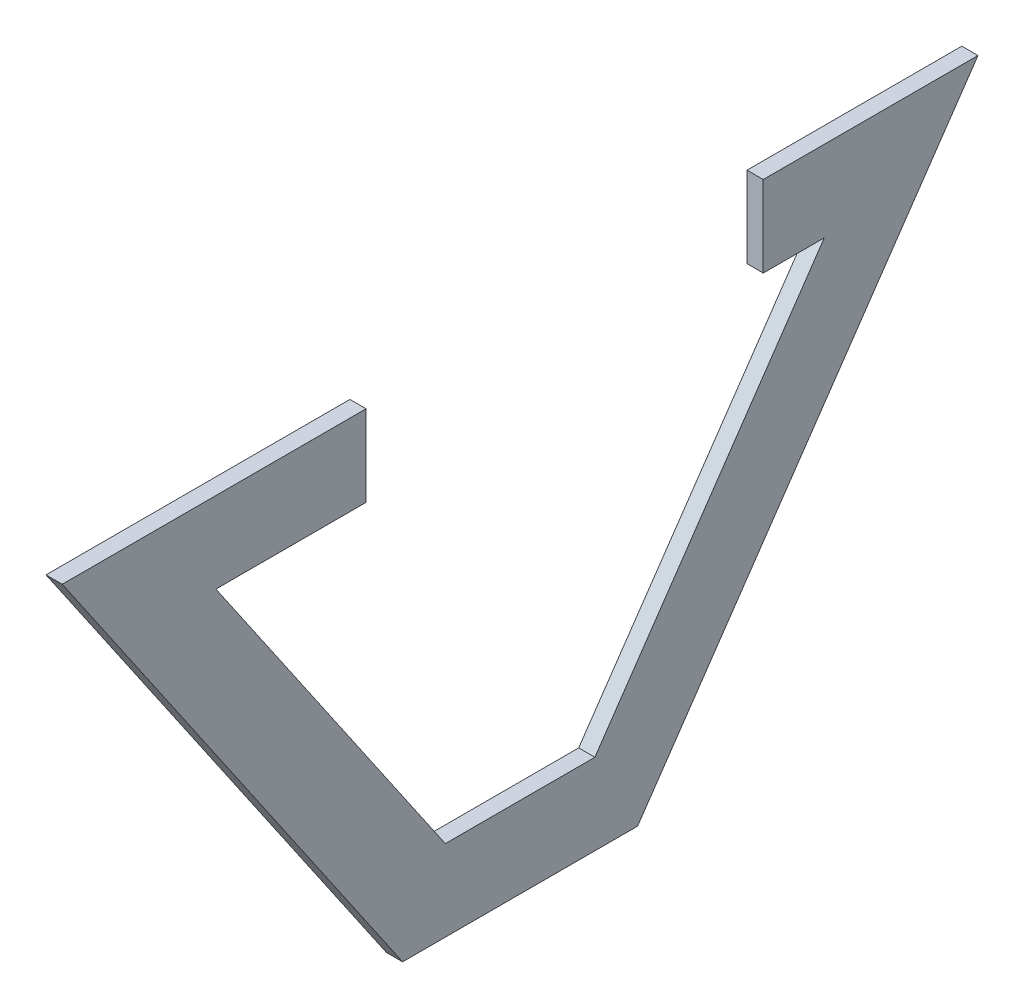
ISO-10303-21;
HEADER;
FILE_DESCRIPTION(('STEP AP214'),'2;1');
FILE_NAME('part.step','',(''),(''),'','','');
FILE_SCHEMA(('AUTOMOTIVE_DESIGN { 1 0 10303 214 1 1 1 1 }'));
ENDSEC;
DATA;
#1=APPLICATION_CONTEXT('core data for automotive mechanical design processes');
#2=APPLICATION_PROTOCOL_DEFINITION('international standard','automotive_design',2000,#1);
#3=PRODUCT_CONTEXT('',#1,'mechanical');
#4=PRODUCT('Part','Part','',(#3));
#5=PRODUCT_RELATED_PRODUCT_CATEGORY('part','',(#4));
#6=PRODUCT_DEFINITION_FORMATION('','',#4);
#7=PRODUCT_DEFINITION_CONTEXT('part definition',#1,'design');
#8=PRODUCT_DEFINITION('design','',#6,#7);
#9=PRODUCT_DEFINITION_SHAPE('','',#8);
#10=(LENGTH_UNIT() NAMED_UNIT(*) SI_UNIT(.MILLI.,.METRE.));
#11=(NAMED_UNIT(*) PLANE_ANGLE_UNIT() SI_UNIT($,.RADIAN.));
#12=(NAMED_UNIT(*) SI_UNIT($,.STERADIAN.) SOLID_ANGLE_UNIT());
#13=UNCERTAINTY_MEASURE_WITH_UNIT(LENGTH_MEASURE(1.E-05),#10,'distance_accuracy_value','');
#14=(GEOMETRIC_REPRESENTATION_CONTEXT(3) GLOBAL_UNCERTAINTY_ASSIGNED_CONTEXT((#13)) GLOBAL_UNIT_ASSIGNED_CONTEXT((#10,
#11,#12)) REPRESENTATION_CONTEXT('',''));
#15=CARTESIAN_POINT('',(0.,0.,0.));
#16=DIRECTION('',(0.,0.,1.));
#17=DIRECTION('',(1.,0.,0.));
#18=AXIS2_PLACEMENT_3D('',#15,#16,#17);
#19=CARTESIAN_POINT('',(-2.,39.3247126436782,-56.5));
#20=DIRECTION('',(0.,1.,0.));
#21=DIRECTION('',(0.,0.,1.));
#22=AXIS2_PLACEMENT_3D('',#19,#20,#21);
#23=PLANE('',#22);
#24=DIRECTION('',(-1.,0.,0.));
#25=VECTOR('',#24,1.);
#26=CARTESIAN_POINT('',(-2.,39.3247126436782,-30.));
#27=LINE('',#26,#25);
#28=CARTESIAN_POINT('',(0.,39.3247126436782,-30.));
#29=VERTEX_POINT('',#28);
#30=CARTESIAN_POINT('',(-2.,39.3247126436782,-30.));
#31=VERTEX_POINT('',#30);
#32=EDGE_CURVE('E193',#29,#31,#27,.T.);
#33=ORIENTED_EDGE('',*,*,#32,.F.);
#34=DIRECTION('',(0.,0.,1.));
#35=VECTOR('',#34,1.);
#36=CARTESIAN_POINT('',(0.,39.3247126436782,-56.5));
#37=LINE('',#36,#35);
#38=CARTESIAN_POINT('',(0.,39.3247126436782,-56.5));
#39=VERTEX_POINT('',#38);
#40=EDGE_CURVE('E154',#39,#29,#37,.T.);
#41=ORIENTED_EDGE('',*,*,#40,.F.);
#42=DIRECTION('',(1.,0.,0.));
#43=VECTOR('',#42,1.);
#44=CARTESIAN_POINT('',(-2.,39.3247126436782,-56.5));
#45=LINE('',#44,#43);
#46=CARTESIAN_POINT('',(-2.,39.3247126436782,-56.5));
#47=VERTEX_POINT('',#46);
#48=EDGE_CURVE('E174',#47,#39,#45,.T.);
#49=ORIENTED_EDGE('',*,*,#48,.F.);
#50=DIRECTION('',(0.,0.,1.));
#51=VECTOR('',#50,1.);
#52=CARTESIAN_POINT('',(-2.,39.3247126436782,-56.5));
#53=LINE('',#52,#51);
#54=EDGE_CURVE('E226',#47,#31,#53,.T.);
#55=ORIENTED_EDGE('',*,*,#54,.T.);
#56=EDGE_LOOP('',(#33,#41,#49,#55));
#57=FACE_BOUND('',#56,.T.);
#58=ADVANCED_FACE('F45',(#57),#23,.T.);
#59=CARTESIAN_POINT('',(-2.,29.3247126436782,-37.5352547996728));
#60=DIRECTION('',(0.,1.,0.));
#61=DIRECTION('',(0.,0.,1.));
#62=AXIS2_PLACEMENT_3D('',#59,#60,#61);
#63=PLANE('',#62);
#64=DIRECTION('',(0.,0.,1.));
#65=VECTOR('',#64,1.);
#66=CARTESIAN_POINT('',(0.,29.3247126436782,-37.5352547996728));
#67=LINE('',#66,#65);
#68=CARTESIAN_POINT('',(0.,29.3247126436782,-37.5352547996728));
#69=VERTEX_POINT('',#68);
#70=CARTESIAN_POINT('',(0.,29.3247126436782,-30.));
#71=VERTEX_POINT('',#70);
#72=EDGE_CURVE('E209',#69,#71,#67,.T.);
#73=ORIENTED_EDGE('',*,*,#72,.T.);
#74=DIRECTION('',(-1.,0.,0.));
#75=VECTOR('',#74,1.);
#76=CARTESIAN_POINT('',(-2.,29.3247126436782,-30.));
#77=LINE('',#76,#75);
#78=CARTESIAN_POINT('',(-2.,29.3247126436782,-30.));
#79=VERTEX_POINT('',#78);
#80=EDGE_CURVE('E11',#71,#79,#77,.T.);
#81=ORIENTED_EDGE('',*,*,#80,.T.);
#82=DIRECTION('',(0.,0.,1.));
#83=VECTOR('',#82,1.);
#84=CARTESIAN_POINT('',(-2.,29.3247126436782,-37.5352547996728));
#85=LINE('',#84,#83);
#86=CARTESIAN_POINT('',(-2.,29.3247126436782,-37.5352547996728));
#87=VERTEX_POINT('',#86);
#88=EDGE_CURVE('E200',#87,#79,#85,.T.);
#89=ORIENTED_EDGE('',*,*,#88,.F.);
#90=DIRECTION('',(1.,0.,0.));
#91=VECTOR('',#90,1.);
#92=CARTESIAN_POINT('',(-2.,29.3247126436782,-37.5352547996728));
#93=LINE('',#92,#91);
#94=EDGE_CURVE('E207',#87,#69,#93,.T.);
#95=ORIENTED_EDGE('',*,*,#94,.T.);
#96=EDGE_LOOP('',(#73,#81,#89,#95));
#97=FACE_BOUND('',#96,.T.);
#98=ADVANCED_FACE('F251',(#97),#63,.F.);
#99=CARTESIAN_POINT('',(-2.,-22.0258620689655,-14.5));
#100=DIRECTION('',(0.,-0.564897269685444,-0.825161241638221));
#101=DIRECTION('',(0.,0.825161241638221,-0.564897269685444));
#102=AXIS2_PLACEMENT_3D('',#99,#100,#101);
#103=PLANE('',#102);
#104=DIRECTION('',(0.,0.825161241638221,-0.564897269685444));
#105=VECTOR('',#104,1.);
#106=CARTESIAN_POINT('',(0.,-22.0258620689655,-14.5));
#107=LINE('',#106,#105);
#108=CARTESIAN_POINT('',(0.,-22.0258620689655,-14.5));
#109=VERTEX_POINT('',#108);
#110=EDGE_CURVE('E155',#109,#39,#107,.T.);
#111=ORIENTED_EDGE('',*,*,#110,.F.);
#112=DIRECTION('',(1.,0.,0.));
#113=VECTOR('',#112,1.);
#114=CARTESIAN_POINT('',(-2.,-22.0258620689655,-14.5));
#115=LINE('',#114,#113);
#116=CARTESIAN_POINT('',(-2.,-22.0258620689655,-14.5));
#117=VERTEX_POINT('',#116);
#118=EDGE_CURVE('E169',#117,#109,#115,.T.);
#119=ORIENTED_EDGE('',*,*,#118,.F.);
#120=DIRECTION('',(0.,0.825161241638221,-0.564897269685444));
#121=VECTOR('',#120,1.);
#122=CARTESIAN_POINT('',(-2.,-22.0258620689655,-14.5));
#123=LINE('',#122,#121);
#124=EDGE_CURVE('E168',#117,#47,#123,.T.);
#125=ORIENTED_EDGE('',*,*,#124,.T.);
#126=ORIENTED_EDGE('',*,*,#48,.T.);
#127=EDGE_LOOP('',(#111,#119,#125,#126));
#128=FACE_BOUND('',#127,.T.);
#129=ADVANCED_FACE('F47',(#128),#103,.T.);
#130=CARTESIAN_POINT('',(-2.,-22.0258620689655,14.5));
#131=DIRECTION('',(0.,-1.,0.));
#132=DIRECTION('',(0.,0.,-1.));
#133=AXIS2_PLACEMENT_3D('',#130,#131,#132);
#134=PLANE('',#133);
#135=DIRECTION('',(0.,0.,-1.));
#136=VECTOR('',#135,1.);
#137=CARTESIAN_POINT('',(0.,-22.0258620689655,14.5));
#138=LINE('',#137,#136);
#139=CARTESIAN_POINT('',(0.,-22.0258620689655,14.5));
#140=VERTEX_POINT('',#139);
#141=EDGE_CURVE('E165',#140,#109,#138,.T.);
#142=ORIENTED_EDGE('',*,*,#141,.F.);
#143=DIRECTION('',(1.,0.,0.));
#144=VECTOR('',#143,1.);
#145=CARTESIAN_POINT('',(-2.,-22.0258620689655,14.5));
#146=LINE('',#145,#144);
#147=CARTESIAN_POINT('',(-2.,-22.0258620689655,14.5));
#148=VERTEX_POINT('',#147);
#149=EDGE_CURVE('E171',#148,#140,#146,.T.);
#150=ORIENTED_EDGE('',*,*,#149,.F.);
#151=DIRECTION('',(0.,0.,-1.));
#152=VECTOR('',#151,1.);
#153=CARTESIAN_POINT('',(-2.,-22.0258620689655,14.5));
#154=LINE('',#153,#152);
#155=EDGE_CURVE('E175',#148,#117,#154,.T.);
#156=ORIENTED_EDGE('',*,*,#155,.T.);
#157=ORIENTED_EDGE('',*,*,#118,.T.);
#158=EDGE_LOOP('',(#142,#150,#156,#157));
#159=FACE_BOUND('',#158,.T.);
#160=ADVANCED_FACE('F235',(#159),#134,.T.);
#161=CARTESIAN_POINT('',(-2.,-22.0258620689655,14.5));
#162=DIRECTION('',(0.,-0.564897269685444,0.825161241638221));
#163=DIRECTION('',(0.,-0.825161241638221,-0.564897269685444));
#164=AXIS2_PLACEMENT_3D('',#161,#162,#163);
#165=PLANE('',#164);
#166=DIRECTION('',(0.,-0.825161241638221,-0.564897269685444));
#167=VECTOR('',#166,1.);
#168=CARTESIAN_POINT('',(0.,-22.0258620689655,14.5));
#169=LINE('',#168,#167);
#170=CARTESIAN_POINT('',(0.,39.3247126436781,56.5));
#171=VERTEX_POINT('',#170);
#172=EDGE_CURVE('E158',#171,#140,#169,.T.);
#173=ORIENTED_EDGE('',*,*,#172,.F.);
#174=DIRECTION('',(1.,0.,0.));
#175=VECTOR('',#174,1.);
#176=CARTESIAN_POINT('',(-2.,39.3247126436781,56.5));
#177=LINE('',#176,#175);
#178=CARTESIAN_POINT('',(-2.,39.3247126436781,56.5));
#179=VERTEX_POINT('',#178);
#180=EDGE_CURVE('E152',#179,#171,#177,.T.);
#181=ORIENTED_EDGE('',*,*,#180,.F.);
#182=DIRECTION('',(0.,-0.825161241638221,-0.564897269685444));
#183=VECTOR('',#182,1.);
#184=CARTESIAN_POINT('',(-2.,-22.0258620689655,14.5));
#185=LINE('',#184,#183);
#186=EDGE_CURVE('E229',#179,#148,#185,.T.);
#187=ORIENTED_EDGE('',*,*,#186,.T.);
#188=ORIENTED_EDGE('',*,*,#149,.T.);
#189=EDGE_LOOP('',(#173,#181,#187,#188));
#190=FACE_BOUND('',#189,.T.);
#191=ADVANCED_FACE('F242',(#190),#165,.T.);
#192=DIRECTION('',(1.,0.,0.));
#193=VECTOR('',#192,1.);
#194=CARTESIAN_POINT('',(-2.,39.3247126436782,19.));
#195=LINE('',#194,#193);
#196=CARTESIAN_POINT('',(-2.,39.3247126436782,19.));
#197=VERTEX_POINT('',#196);
#198=CARTESIAN_POINT('',(0.,39.3247126436782,19.));
#199=VERTEX_POINT('',#198);
#200=EDGE_CURVE('E131',#197,#199,#195,.T.);
#201=ORIENTED_EDGE('',*,*,#200,.F.);
#202=EDGE_CURVE('E188',#197,#179,#53,.T.);
#203=ORIENTED_EDGE('',*,*,#202,.T.);
#204=ORIENTED_EDGE('',*,*,#180,.T.);
#205=EDGE_CURVE('E144',#199,#171,#37,.T.);
#206=ORIENTED_EDGE('',*,*,#205,.F.);
#207=EDGE_LOOP('',(#201,#203,#204,#206));
#208=FACE_BOUND('',#207,.T.);
#209=ADVANCED_FACE('F150',(#208),#23,.T.);
#210=CARTESIAN_POINT('',(-2.,0.,0.));
#211=DIRECTION('',(1.,0.,0.));
#212=DIRECTION('',(0.,0.,-1.));
#213=AXIS2_PLACEMENT_3D('',#210,#211,#212);
#214=PLANE('',#213);
#215=ORIENTED_EDGE('',*,*,#88,.T.);
#216=DIRECTION('',(0.,1.,0.));
#217=VECTOR('',#216,1.);
#218=CARTESIAN_POINT('',(-2.,0.,-30.));
#219=LINE('',#218,#217);
#220=EDGE_CURVE('E60',#79,#31,#219,.T.);
#221=ORIENTED_EDGE('',*,*,#220,.T.);
#222=ORIENTED_EDGE('',*,*,#54,.F.);
#223=ORIENTED_EDGE('',*,*,#124,.F.);
#224=ORIENTED_EDGE('',*,*,#155,.F.);
#225=ORIENTED_EDGE('',*,*,#186,.F.);
#226=ORIENTED_EDGE('',*,*,#202,.F.);
#227=DIRECTION('',(0.,-1.,0.));
#228=VECTOR('',#227,1.);
#229=CARTESIAN_POINT('',(-2.,0.,19.));
#230=LINE('',#229,#228);
#231=CARTESIAN_POINT('',(-2.,29.3247126436782,19.));
#232=VERTEX_POINT('',#231);
#233=EDGE_CURVE('E134',#197,#232,#230,.T.);
#234=ORIENTED_EDGE('',*,*,#233,.T.);
#235=CARTESIAN_POINT('',(-2.,29.3247126436782,37.5352547996728));
#236=VERTEX_POINT('',#235);
#237=EDGE_CURVE('E181',#232,#236,#85,.T.);
#238=ORIENTED_EDGE('',*,*,#237,.T.);
#239=DIRECTION('',(0.,-0.825161241638221,-0.564897269685445));
#240=VECTOR('',#239,1.);
#241=CARTESIAN_POINT('',(-2.,-12.0258620689655,9.22705807836136));
#242=LINE('',#241,#240);
#243=CARTESIAN_POINT('',(-2.,-12.0258620689655,9.22705807836136));
#244=VERTEX_POINT('',#243);
#245=EDGE_CURVE('E202',#236,#244,#242,.T.);
#246=ORIENTED_EDGE('',*,*,#245,.T.);
#247=DIRECTION('',(0.,0.,-1.));
#248=VECTOR('',#247,1.);
#249=CARTESIAN_POINT('',(-2.,-12.0258620689655,9.22705807836136));
#250=LINE('',#249,#248);
#251=CARTESIAN_POINT('',(-2.,-12.0258620689655,-9.22705807836137));
#252=VERTEX_POINT('',#251);
#253=EDGE_CURVE('E204',#244,#252,#250,.T.);
#254=ORIENTED_EDGE('',*,*,#253,.T.);
#255=DIRECTION('',(0.,0.825161241638221,-0.564897269685444));
#256=VECTOR('',#255,1.);
#257=CARTESIAN_POINT('',(-2.,-12.0258620689655,-9.22705807836137));
#258=LINE('',#257,#256);
#259=EDGE_CURVE('E196',#252,#87,#258,.T.);
#260=ORIENTED_EDGE('',*,*,#259,.T.);
#261=EDGE_LOOP('',(#215,#221,#222,#223,#224,#225,#226,#234,#238,#246,#254,#260));
#262=FACE_BOUND('',#261,.T.);
#263=ADVANCED_FACE('F184',(#262),#214,.F.);
#264=CARTESIAN_POINT('',(0.,0.,0.));
#265=DIRECTION('',(1.,0.,0.));
#266=DIRECTION('',(0.,0.,-1.));
#267=AXIS2_PLACEMENT_3D('',#264,#265,#266);
#268=PLANE('',#267);
#269=DIRECTION('',(0.,1.,0.));
#270=VECTOR('',#269,1.);
#271=CARTESIAN_POINT('',(0.,29.0921194378148,-30.));
#272=LINE('',#271,#270);
#273=EDGE_CURVE('E148',#71,#29,#272,.T.);
#274=ORIENTED_EDGE('',*,*,#273,.F.);
#275=ORIENTED_EDGE('',*,*,#72,.F.);
#276=DIRECTION('',(0.,0.825161241638221,-0.564897269685444));
#277=VECTOR('',#276,1.);
#278=CARTESIAN_POINT('',(0.,-12.0258620689655,-9.22705807836137));
#279=LINE('',#278,#277);
#280=CARTESIAN_POINT('',(0.,-12.0258620689655,-9.22705807836137));
#281=VERTEX_POINT('',#280);
#282=EDGE_CURVE('E195',#281,#69,#279,.T.);
#283=ORIENTED_EDGE('',*,*,#282,.F.);
#284=DIRECTION('',(0.,0.,-1.));
#285=VECTOR('',#284,1.);
#286=CARTESIAN_POINT('',(0.,-12.0258620689655,9.22705807836136));
#287=LINE('',#286,#285);
#288=CARTESIAN_POINT('',(0.,-12.0258620689655,9.22705807836136));
#289=VERTEX_POINT('',#288);
#290=EDGE_CURVE('E199',#289,#281,#287,.T.);
#291=ORIENTED_EDGE('',*,*,#290,.F.);
#292=DIRECTION('',(0.,-0.825161241638221,-0.564897269685445));
#293=VECTOR('',#292,1.);
#294=CARTESIAN_POINT('',(0.,-12.0258620689655,9.22705807836136));
#295=LINE('',#294,#293);
#296=CARTESIAN_POINT('',(0.,29.3247126436782,37.5352547996728));
#297=VERTEX_POINT('',#296);
#298=EDGE_CURVE('E212',#297,#289,#295,.T.);
#299=ORIENTED_EDGE('',*,*,#298,.F.);
#300=CARTESIAN_POINT('',(0.,29.3247126436782,19.));
#301=VERTEX_POINT('',#300);
#302=EDGE_CURVE('E147',#301,#297,#67,.T.);
#303=ORIENTED_EDGE('',*,*,#302,.F.);
#304=DIRECTION('',(0.,-1.,0.));
#305=VECTOR('',#304,1.);
#306=CARTESIAN_POINT('',(0.,45.7273785091654,19.));
#307=LINE('',#306,#305);
#308=EDGE_CURVE('E67',#199,#301,#307,.T.);
#309=ORIENTED_EDGE('',*,*,#308,.F.);
#310=ORIENTED_EDGE('',*,*,#205,.T.);
#311=ORIENTED_EDGE('',*,*,#172,.T.);
#312=ORIENTED_EDGE('',*,*,#141,.T.);
#313=ORIENTED_EDGE('',*,*,#110,.T.);
#314=ORIENTED_EDGE('',*,*,#40,.T.);
#315=EDGE_LOOP('',(#274,#275,#283,#291,#299,#303,#309,#310,#311,#312,#313,#314));
#316=FACE_BOUND('',#315,.T.);
#317=ADVANCED_FACE('F142',(#316),#268,.T.);
#318=CARTESIAN_POINT('',(-2.,-12.0258620689655,-9.22705807836137));
#319=DIRECTION('',(0.,-0.564897269685444,-0.825161241638221));
#320=DIRECTION('',(0.,0.825161241638221,-0.564897269685444));
#321=AXIS2_PLACEMENT_3D('',#318,#319,#320);
#322=PLANE('',#321);
#323=ORIENTED_EDGE('',*,*,#282,.T.);
#324=ORIENTED_EDGE('',*,*,#94,.F.);
#325=ORIENTED_EDGE('',*,*,#259,.F.);
#326=DIRECTION('',(1.,0.,0.));
#327=VECTOR('',#326,1.);
#328=CARTESIAN_POINT('',(-2.,-12.0258620689655,-9.22705807836137));
#329=LINE('',#328,#327);
#330=EDGE_CURVE('E160',#252,#281,#329,.T.);
#331=ORIENTED_EDGE('',*,*,#330,.T.);
#332=EDGE_LOOP('',(#323,#324,#325,#331));
#333=FACE_BOUND('',#332,.T.);
#334=ADVANCED_FACE('F264',(#333),#322,.F.);
#335=CARTESIAN_POINT('',(-2.,-12.0258620689655,9.22705807836136));
#336=DIRECTION('',(0.,-1.,0.));
#337=DIRECTION('',(0.,0.,-1.));
#338=AXIS2_PLACEMENT_3D('',#335,#336,#337);
#339=PLANE('',#338);
#340=ORIENTED_EDGE('',*,*,#290,.T.);
#341=ORIENTED_EDGE('',*,*,#330,.F.);
#342=ORIENTED_EDGE('',*,*,#253,.F.);
#343=DIRECTION('',(1.,0.,0.));
#344=VECTOR('',#343,1.);
#345=CARTESIAN_POINT('',(-2.,-12.0258620689655,9.22705807836136));
#346=LINE('',#345,#344);
#347=EDGE_CURVE('E218',#244,#289,#346,.T.);
#348=ORIENTED_EDGE('',*,*,#347,.T.);
#349=EDGE_LOOP('',(#340,#341,#342,#348));
#350=FACE_BOUND('',#349,.T.);
#351=ADVANCED_FACE('F267',(#350),#339,.F.);
#352=CARTESIAN_POINT('',(-2.,-12.0258620689655,9.22705807836136));
#353=DIRECTION('',(0.,-0.564897269685444,0.825161241638221));
#354=DIRECTION('',(0.,-0.825161241638221,-0.564897269685444));
#355=AXIS2_PLACEMENT_3D('',#352,#353,#354);
#356=PLANE('',#355);
#357=ORIENTED_EDGE('',*,*,#298,.T.);
#358=ORIENTED_EDGE('',*,*,#347,.F.);
#359=ORIENTED_EDGE('',*,*,#245,.F.);
#360=DIRECTION('',(1.,0.,0.));
#361=VECTOR('',#360,1.);
#362=CARTESIAN_POINT('',(-2.,29.3247126436782,37.5352547996728));
#363=LINE('',#362,#361);
#364=EDGE_CURVE('E220',#236,#297,#363,.T.);
#365=ORIENTED_EDGE('',*,*,#364,.T.);
#366=EDGE_LOOP('',(#357,#358,#359,#365));
#367=FACE_BOUND('',#366,.T.);
#368=ADVANCED_FACE('F270',(#367),#356,.F.);
#369=ORIENTED_EDGE('',*,*,#237,.F.);
#370=DIRECTION('',(1.,0.,0.));
#371=VECTOR('',#370,1.);
#372=CARTESIAN_POINT('',(-2.,29.3247126436782,19.));
#373=LINE('',#372,#371);
#374=EDGE_CURVE('E53',#232,#301,#373,.T.);
#375=ORIENTED_EDGE('',*,*,#374,.T.);
#376=ORIENTED_EDGE('',*,*,#302,.T.);
#377=ORIENTED_EDGE('',*,*,#364,.F.);
#378=EDGE_LOOP('',(#369,#375,#376,#377));
#379=FACE_BOUND('',#378,.T.);
#380=ADVANCED_FACE('F178',(#379),#63,.F.);
#381=CARTESIAN_POINT('',(-49.,45.7273785091654,19.));
#382=DIRECTION('',(0.,0.,1.));
#383=DIRECTION('',(1.,0.,0.));
#384=AXIS2_PLACEMENT_3D('',#381,#382,#383);
#385=PLANE('',#384);
#386=ORIENTED_EDGE('',*,*,#200,.T.);
#387=ORIENTED_EDGE('',*,*,#308,.T.);
#388=ORIENTED_EDGE('',*,*,#374,.F.);
#389=ORIENTED_EDGE('',*,*,#233,.F.);
#390=EDGE_LOOP('',(#386,#387,#388,#389));
#391=FACE_BOUND('',#390,.T.);
#392=ADVANCED_FACE('F132',(#391),#385,.F.);
#393=CARTESIAN_POINT('',(-49.,29.0921194378148,-30.));
#394=DIRECTION('',(0.,0.,-1.));
#395=DIRECTION('',(0.,1.,0.));
#396=AXIS2_PLACEMENT_3D('',#393,#394,#395);
#397=PLANE('',#396);
#398=ORIENTED_EDGE('',*,*,#32,.T.);
#399=ORIENTED_EDGE('',*,*,#220,.F.);
#400=ORIENTED_EDGE('',*,*,#80,.F.);
#401=ORIENTED_EDGE('',*,*,#273,.T.);
#402=EDGE_LOOP('',(#398,#399,#400,#401));
#403=FACE_BOUND('',#402,.T.);
#404=ADVANCED_FACE('F317',(#403),#397,.F.);
#405=CLOSED_SHELL('',(#58,#98,#129,#160,#191,#209,#263,#317,#334,#351,#368,#380,#392,#404));
#406=MANIFOLD_SOLID_BREP('B2',#405);
#407=ADVANCED_BREP_SHAPE_REPRESENTATION('',(#18,#406),#14);
#408=SHAPE_DEFINITION_REPRESENTATION(#9,#407);
ENDSEC;
END-ISO-10303-21;
